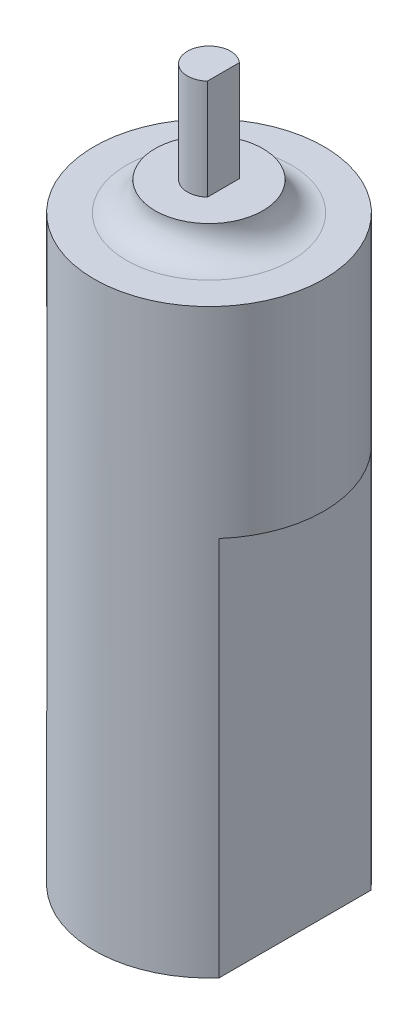
ISO-10303-21;
HEADER;
FILE_DESCRIPTION(('STEP AP214'),'2;1');
FILE_NAME('part.step','',(''),(''),'','','');
FILE_SCHEMA(('AUTOMOTIVE_DESIGN { 1 0 10303 214 1 1 1 1 }'));
ENDSEC;
DATA;
#1=APPLICATION_CONTEXT('core data for automotive mechanical design processes');
#2=APPLICATION_PROTOCOL_DEFINITION('international standard','automotive_design',2000,#1);
#3=PRODUCT_CONTEXT('',#1,'mechanical');
#4=PRODUCT('Part','Part','',(#3));
#5=PRODUCT_RELATED_PRODUCT_CATEGORY('part','',(#4));
#6=PRODUCT_DEFINITION_FORMATION('','',#4);
#7=PRODUCT_DEFINITION_CONTEXT('part definition',#1,'design');
#8=PRODUCT_DEFINITION('design','',#6,#7);
#9=PRODUCT_DEFINITION_SHAPE('','',#8);
#10=(LENGTH_UNIT() NAMED_UNIT(*) SI_UNIT(.MILLI.,.METRE.));
#11=(NAMED_UNIT(*) PLANE_ANGLE_UNIT() SI_UNIT($,.RADIAN.));
#12=(NAMED_UNIT(*) SI_UNIT($,.STERADIAN.) SOLID_ANGLE_UNIT());
#13=UNCERTAINTY_MEASURE_WITH_UNIT(LENGTH_MEASURE(1.E-05),#10,'distance_accuracy_value','');
#14=(GEOMETRIC_REPRESENTATION_CONTEXT(3) GLOBAL_UNCERTAINTY_ASSIGNED_CONTEXT((#13)) GLOBAL_UNIT_ASSIGNED_CONTEXT((#10,
#11,#12)) REPRESENTATION_CONTEXT('',''));
#15=CARTESIAN_POINT('',(0.,0.,0.));
#16=DIRECTION('',(0.,0.,1.));
#17=DIRECTION('',(1.,0.,0.));
#18=AXIS2_PLACEMENT_3D('',#15,#16,#17);
#19=CARTESIAN_POINT('',(0.,40.5,0.));
#20=DIRECTION('',(0.,-1.,0.));
#21=DIRECTION('',(0.,0.,-1.));
#22=AXIS2_PLACEMENT_3D('',#19,#20,#21);
#23=CYLINDRICAL_SURFACE('',#22,8.);
#24=CARTESIAN_POINT('',(0.,40.5,0.));
#25=DIRECTION('',(0.,1.,0.));
#26=DIRECTION('',(0.,0.,1.));
#27=AXIS2_PLACEMENT_3D('',#24,#25,#26);
#28=CIRCLE('',#27,8.);
#29=CARTESIAN_POINT('',(0.,40.5,8.));
#30=VERTEX_POINT('',#29);
#31=EDGE_CURVE('E130',#30,#30,#28,.T.);
#32=ORIENTED_EDGE('',*,*,#31,.F.);
#33=EDGE_LOOP('',(#32));
#34=FACE_BOUND('',#33,.T.);
#35=CARTESIAN_POINT('',(0.,26.5,0.));
#36=DIRECTION('',(0.,1.,0.));
#37=DIRECTION('',(0.,0.,1.));
#38=AXIS2_PLACEMENT_3D('',#35,#36,#37);
#39=CIRCLE('',#38,8.);
#40=CARTESIAN_POINT('',(6.,26.5,5.29150262212918));
#41=VERTEX_POINT('',#40);
#42=CARTESIAN_POINT('',(6.,26.5,-5.29150262212918));
#43=VERTEX_POINT('',#42);
#44=EDGE_CURVE('E41',#41,#43,#39,.T.);
#45=ORIENTED_EDGE('',*,*,#44,.T.);
#46=DIRECTION('',(0.,-1.,0.));
#47=VECTOR('',#46,1.);
#48=CARTESIAN_POINT('',(6.,26.5,-5.29150262212918));
#49=LINE('',#48,#47);
#50=CARTESIAN_POINT('',(6.,0.,-5.29150262212918));
#51=VERTEX_POINT('',#50);
#52=EDGE_CURVE('E118',#43,#51,#49,.T.);
#53=ORIENTED_EDGE('',*,*,#52,.T.);
#54=CARTESIAN_POINT('',(0.,0.,0.));
#55=DIRECTION('',(0.,1.,0.));
#56=DIRECTION('',(0.,0.,1.));
#57=AXIS2_PLACEMENT_3D('',#54,#55,#56);
#58=CIRCLE('',#57,8.);
#59=CARTESIAN_POINT('',(-6.,0.,-5.29150262212918));
#60=VERTEX_POINT('',#59);
#61=EDGE_CURVE('E134',#51,#60,#58,.T.);
#62=ORIENTED_EDGE('',*,*,#61,.T.);
#63=DIRECTION('',(0.,-1.,0.));
#64=VECTOR('',#63,1.);
#65=CARTESIAN_POINT('',(-6.,26.5,-5.29150262212918));
#66=LINE('',#65,#64);
#67=CARTESIAN_POINT('',(-6.,26.5,-5.29150262212918));
#68=VERTEX_POINT('',#67);
#69=EDGE_CURVE('E56',#68,#60,#66,.T.);
#70=ORIENTED_EDGE('',*,*,#69,.F.);
#71=CARTESIAN_POINT('',(0.,26.5,0.));
#72=DIRECTION('',(0.,-1.,0.));
#73=DIRECTION('',(0.,0.,-1.));
#74=AXIS2_PLACEMENT_3D('',#71,#72,#73);
#75=CIRCLE('',#74,8.);
#76=CARTESIAN_POINT('',(-6.,26.5,5.29150262212918));
#77=VERTEX_POINT('',#76);
#78=EDGE_CURVE('E133',#77,#68,#75,.T.);
#79=ORIENTED_EDGE('',*,*,#78,.F.);
#80=DIRECTION('',(0.,-1.,0.));
#81=VECTOR('',#80,1.);
#82=CARTESIAN_POINT('',(-6.,26.5,5.29150262212918));
#83=LINE('',#82,#81);
#84=CARTESIAN_POINT('',(-6.,0.,5.29150262212918));
#85=VERTEX_POINT('',#84);
#86=EDGE_CURVE('E117',#77,#85,#83,.T.);
#87=ORIENTED_EDGE('',*,*,#86,.T.);
#88=CARTESIAN_POINT('',(6.,0.,5.29150262212918));
#89=VERTEX_POINT('',#88);
#90=EDGE_CURVE('E121',#85,#89,#58,.T.);
#91=ORIENTED_EDGE('',*,*,#90,.T.);
#92=DIRECTION('',(0.,-1.,0.));
#93=VECTOR('',#92,1.);
#94=CARTESIAN_POINT('',(6.,26.5,5.29150262212918));
#95=LINE('',#94,#93);
#96=EDGE_CURVE('E114',#41,#89,#95,.T.);
#97=ORIENTED_EDGE('',*,*,#96,.F.);
#98=EDGE_LOOP('',(#45,#53,#62,#70,#79,#87,#91,#97));
#99=FACE_BOUND('',#98,.T.);
#100=ADVANCED_FACE('F33',(#34,#99),#23,.T.);
#101=CARTESIAN_POINT('',(0.,40.5,0.));
#102=DIRECTION('',(0.,1.,0.));
#103=DIRECTION('',(0.,0.,1.));
#104=AXIS2_PLACEMENT_3D('',#101,#102,#103);
#105=PLANE('',#104);
#106=CARTESIAN_POINT('',(0.,40.5,0.));
#107=DIRECTION('',(0.,1.,0.));
#108=DIRECTION('',(0.,0.,1.));
#109=AXIS2_PLACEMENT_3D('',#106,#107,#108);
#110=CIRCLE('',#109,5.75);
#111=CARTESIAN_POINT('',(0.,40.5,5.75));
#112=VERTEX_POINT('',#111);
#113=EDGE_CURVE('E11',#112,#112,#110,.F.);
#114=ORIENTED_EDGE('',*,*,#113,.T.);
#115=EDGE_LOOP('',(#114));
#116=FACE_BOUND('',#115,.T.);
#117=ORIENTED_EDGE('',*,*,#31,.T.);
#118=EDGE_LOOP('',(#117));
#119=FACE_BOUND('',#118,.T.);
#120=ADVANCED_FACE('F162',(#116,#119),#105,.T.);
#121=CARTESIAN_POINT('',(0.,0.,0.));
#122=DIRECTION('',(0.,1.,0.));
#123=DIRECTION('',(0.,0.,1.));
#124=AXIS2_PLACEMENT_3D('',#121,#122,#123);
#125=PLANE('',#124);
#126=ORIENTED_EDGE('',*,*,#61,.F.);
#127=DIRECTION('',(0.,0.,-1.));
#128=VECTOR('',#127,1.);
#129=CARTESIAN_POINT('',(6.,0.,-5.29150262212918));
#130=LINE('',#129,#128);
#131=EDGE_CURVE('E115',#89,#51,#130,.T.);
#132=ORIENTED_EDGE('',*,*,#131,.F.);
#133=ORIENTED_EDGE('',*,*,#90,.F.);
#134=DIRECTION('',(0.,0.,1.));
#135=VECTOR('',#134,1.);
#136=CARTESIAN_POINT('',(-6.,0.,-5.29150262212918));
#137=LINE('',#136,#135);
#138=EDGE_CURVE('E110',#60,#85,#137,.T.);
#139=ORIENTED_EDGE('',*,*,#138,.F.);
#140=EDGE_LOOP('',(#126,#132,#133,#139));
#141=FACE_BOUND('',#140,.T.);
#142=ADVANCED_FACE('F150',(#141),#125,.F.);
#143=CARTESIAN_POINT('',(0.,26.5,0.));
#144=DIRECTION('',(0.,-1.,0.));
#145=DIRECTION('',(0.,0.,-1.));
#146=AXIS2_PLACEMENT_3D('',#143,#144,#145);
#147=PLANE('',#146);
#148=ORIENTED_EDGE('',*,*,#78,.T.);
#149=DIRECTION('',(0.,0.,1.));
#150=VECTOR('',#149,1.);
#151=CARTESIAN_POINT('',(-6.,26.5,-5.29150262212918));
#152=LINE('',#151,#150);
#153=EDGE_CURVE('E123',#68,#77,#152,.T.);
#154=ORIENTED_EDGE('',*,*,#153,.T.);
#155=EDGE_LOOP('',(#148,#154));
#156=FACE_BOUND('',#155,.T.);
#157=ADVANCED_FACE('F154',(#156),#147,.T.);
#158=CARTESIAN_POINT('',(-6.,26.5,-5.29150262212918));
#159=DIRECTION('',(1.,0.,0.));
#160=DIRECTION('',(0.,0.,-1.));
#161=AXIS2_PLACEMENT_3D('',#158,#159,#160);
#162=PLANE('',#161);
#163=ORIENTED_EDGE('',*,*,#138,.T.);
#164=ORIENTED_EDGE('',*,*,#86,.F.);
#165=ORIENTED_EDGE('',*,*,#153,.F.);
#166=ORIENTED_EDGE('',*,*,#69,.T.);
#167=EDGE_LOOP('',(#163,#164,#165,#166));
#168=FACE_BOUND('',#167,.T.);
#169=ADVANCED_FACE('F152',(#168),#162,.F.);
#170=CARTESIAN_POINT('',(0.,26.5,0.));
#171=DIRECTION('',(0.,1.,0.));
#172=DIRECTION('',(0.,0.,1.));
#173=AXIS2_PLACEMENT_3D('',#170,#171,#172);
#174=PLANE('',#173);
#175=DIRECTION('',(0.,0.,-1.));
#176=VECTOR('',#175,1.);
#177=CARTESIAN_POINT('',(6.,26.5,-5.29150262212918));
#178=LINE('',#177,#176);
#179=EDGE_CURVE('E111',#41,#43,#178,.T.);
#180=ORIENTED_EDGE('',*,*,#179,.T.);
#181=ORIENTED_EDGE('',*,*,#44,.F.);
#182=EDGE_LOOP('',(#180,#181));
#183=FACE_BOUND('',#182,.T.);
#184=ADVANCED_FACE('F144',(#183),#174,.F.);
#185=CARTESIAN_POINT('',(6.,26.5,-5.29150262212918));
#186=DIRECTION('',(-1.,0.,0.));
#187=DIRECTION('',(0.,0.,1.));
#188=AXIS2_PLACEMENT_3D('',#185,#186,#187);
#189=PLANE('',#188);
#190=ORIENTED_EDGE('',*,*,#131,.T.);
#191=ORIENTED_EDGE('',*,*,#52,.F.);
#192=ORIENTED_EDGE('',*,*,#179,.F.);
#193=ORIENTED_EDGE('',*,*,#96,.T.);
#194=EDGE_LOOP('',(#190,#191,#192,#193));
#195=FACE_BOUND('',#194,.T.);
#196=ADVANCED_FACE('F146',(#195),#189,.F.);
#197=CARTESIAN_POINT('',(0.,42.5,0.));
#198=DIRECTION('',(0.,1.,0.));
#199=DIRECTION('',(0.,0.,1.));
#200=AXIS2_PLACEMENT_3D('',#197,#198,#199);
#201=PLANE('',#200);
#202=CARTESIAN_POINT('',(0.,42.5,0.));
#203=DIRECTION('',(0.,1.,0.));
#204=DIRECTION('',(0.,0.,1.));
#205=AXIS2_PLACEMENT_3D('',#202,#203,#204);
#206=CIRCLE('',#205,1.5);
#207=CARTESIAN_POINT('',(1.,42.5,-1.11803398874989));
#208=VERTEX_POINT('',#207);
#209=CARTESIAN_POINT('',(1.,42.5,1.11803398874989));
#210=VERTEX_POINT('',#209);
#211=EDGE_CURVE('E97',#208,#210,#206,.T.);
#212=ORIENTED_EDGE('',*,*,#211,.F.);
#213=DIRECTION('',(0.,0.,1.));
#214=VECTOR('',#213,1.);
#215=CARTESIAN_POINT('',(1.,42.5,-1.11803398874989));
#216=LINE('',#215,#214);
#217=EDGE_CURVE('E85',#208,#210,#216,.T.);
#218=ORIENTED_EDGE('',*,*,#217,.T.);
#219=EDGE_LOOP('',(#212,#218));
#220=FACE_BOUND('',#219,.T.);
#221=CARTESIAN_POINT('',(0.,42.5,0.));
#222=DIRECTION('',(0.,1.,0.));
#223=DIRECTION('',(0.,0.,1.));
#224=AXIS2_PLACEMENT_3D('',#221,#222,#223);
#225=CIRCLE('',#224,3.75);
#226=CARTESIAN_POINT('',(0.,42.5,3.75));
#227=VERTEX_POINT('',#226);
#228=EDGE_CURVE('E104',#227,#227,#225,.T.);
#229=ORIENTED_EDGE('',*,*,#228,.T.);
#230=EDGE_LOOP('',(#229));
#231=FACE_BOUND('',#230,.T.);
#232=ADVANCED_FACE('F101',(#220,#231),#201,.T.);
#233=CARTESIAN_POINT('',(0.,42.5,0.));
#234=DIRECTION('',(0.,1.,0.));
#235=DIRECTION('',(0.,0.,1.));
#236=AXIS2_PLACEMENT_3D('',#233,#234,#235);
#237=TOROIDAL_SURFACE('',#236,5.75,2.);
#238=ORIENTED_EDGE('',*,*,#113,.F.);
#239=EDGE_LOOP('',(#238));
#240=FACE_BOUND('',#239,.T.);
#241=ORIENTED_EDGE('',*,*,#228,.F.);
#242=EDGE_LOOP('',(#241));
#243=FACE_BOUND('',#242,.T.);
#244=ADVANCED_FACE('F35',(#240,#243),#237,.F.);
#245=CARTESIAN_POINT('',(0.,49.5,0.));
#246=DIRECTION('',(0.,-1.,0.));
#247=DIRECTION('',(0.,0.,-1.));
#248=AXIS2_PLACEMENT_3D('',#245,#246,#247);
#249=CYLINDRICAL_SURFACE('',#248,1.5);
#250=CARTESIAN_POINT('',(0.,49.5,0.));
#251=DIRECTION('',(0.,1.,0.));
#252=DIRECTION('',(0.,0.,1.));
#253=AXIS2_PLACEMENT_3D('',#250,#251,#252);
#254=CIRCLE('',#253,1.5);
#255=CARTESIAN_POINT('',(1.,49.5,-1.11803398874989));
#256=VERTEX_POINT('',#255);
#257=CARTESIAN_POINT('',(1.,49.5,1.11803398874989));
#258=VERTEX_POINT('',#257);
#259=EDGE_CURVE('E99',#256,#258,#254,.T.);
#260=ORIENTED_EDGE('',*,*,#259,.F.);
#261=DIRECTION('',(0.,1.,0.));
#262=VECTOR('',#261,1.);
#263=CARTESIAN_POINT('',(1.,42.5,-1.11803398874989));
#264=LINE('',#263,#262);
#265=EDGE_CURVE('E48',#208,#256,#264,.T.);
#266=ORIENTED_EDGE('',*,*,#265,.F.);
#267=ORIENTED_EDGE('',*,*,#211,.T.);
#268=DIRECTION('',(0.,1.,0.));
#269=VECTOR('',#268,1.);
#270=CARTESIAN_POINT('',(1.,42.5,1.11803398874989));
#271=LINE('',#270,#269);
#272=EDGE_CURVE('E88',#210,#258,#271,.T.);
#273=ORIENTED_EDGE('',*,*,#272,.T.);
#274=EDGE_LOOP('',(#260,#266,#267,#273));
#275=FACE_BOUND('',#274,.T.);
#276=ADVANCED_FACE('F96',(#275),#249,.T.);
#277=CARTESIAN_POINT('',(0.,49.5,0.));
#278=DIRECTION('',(0.,1.,0.));
#279=DIRECTION('',(0.,0.,1.));
#280=AXIS2_PLACEMENT_3D('',#277,#278,#279);
#281=PLANE('',#280);
#282=DIRECTION('',(0.,0.,1.));
#283=VECTOR('',#282,1.);
#284=CARTESIAN_POINT('',(1.,49.5,-1.11803398874989));
#285=LINE('',#284,#283);
#286=EDGE_CURVE('E92',#256,#258,#285,.T.);
#287=ORIENTED_EDGE('',*,*,#286,.F.);
#288=ORIENTED_EDGE('',*,*,#259,.T.);
#289=EDGE_LOOP('',(#287,#288));
#290=FACE_BOUND('',#289,.T.);
#291=ADVANCED_FACE('F218',(#290),#281,.T.);
#292=CARTESIAN_POINT('',(1.,42.5,-1.11803398874989));
#293=DIRECTION('',(-1.,0.,0.));
#294=DIRECTION('',(0.,0.,1.));
#295=AXIS2_PLACEMENT_3D('',#292,#293,#294);
#296=PLANE('',#295);
#297=ORIENTED_EDGE('',*,*,#286,.T.);
#298=ORIENTED_EDGE('',*,*,#272,.F.);
#299=ORIENTED_EDGE('',*,*,#217,.F.);
#300=ORIENTED_EDGE('',*,*,#265,.T.);
#301=EDGE_LOOP('',(#297,#298,#299,#300));
#302=FACE_BOUND('',#301,.T.);
#303=ADVANCED_FACE('F86',(#302),#296,.F.);
#304=CLOSED_SHELL('',(#100,#120,#142,#157,#169,#184,#196,#232,#244,#276,#291,#303));
#305=MANIFOLD_SOLID_BREP('B2',#304);
#306=ADVANCED_BREP_SHAPE_REPRESENTATION('',(#18,#305),#14);
#307=SHAPE_DEFINITION_REPRESENTATION(#9,#306);
ENDSEC;
END-ISO-10303-21;
